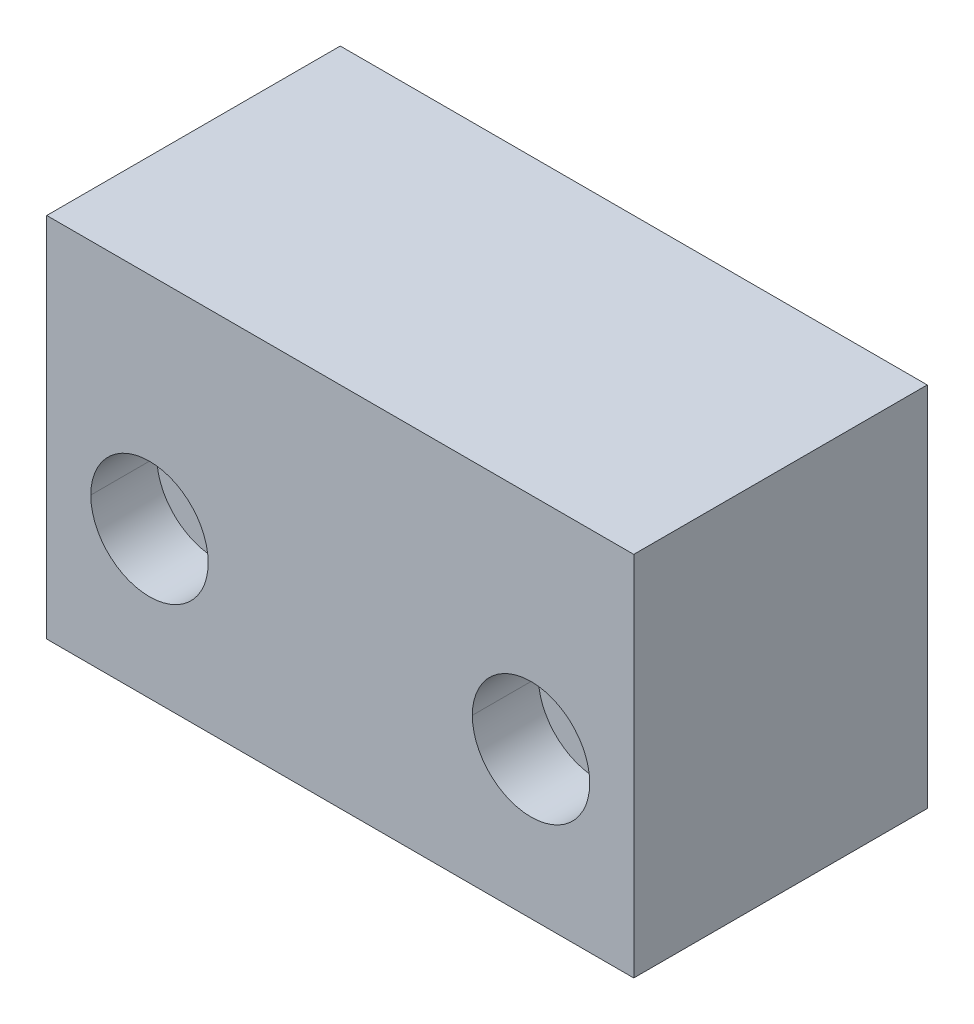
ISO-10303-21;
HEADER;
FILE_DESCRIPTION(('STEP AP214'),'2;1');
FILE_NAME('part.step','',(''),(''),'','','');
FILE_SCHEMA(('AUTOMOTIVE_DESIGN { 1 0 10303 214 1 1 1 1 }'));
ENDSEC;
DATA;
#1=APPLICATION_CONTEXT('core data for automotive mechanical design processes');
#2=APPLICATION_PROTOCOL_DEFINITION('international standard','automotive_design',2000,#1);
#3=PRODUCT_CONTEXT('',#1,'mechanical');
#4=PRODUCT('Part','Part','',(#3));
#5=PRODUCT_RELATED_PRODUCT_CATEGORY('part','',(#4));
#6=PRODUCT_DEFINITION_FORMATION('','',#4);
#7=PRODUCT_DEFINITION_CONTEXT('part definition',#1,'design');
#8=PRODUCT_DEFINITION('design','',#6,#7);
#9=PRODUCT_DEFINITION_SHAPE('','',#8);
#10=(LENGTH_UNIT() NAMED_UNIT(*) SI_UNIT(.MILLI.,.METRE.));
#11=(NAMED_UNIT(*) PLANE_ANGLE_UNIT() SI_UNIT($,.RADIAN.));
#12=(NAMED_UNIT(*) SI_UNIT($,.STERADIAN.) SOLID_ANGLE_UNIT());
#13=UNCERTAINTY_MEASURE_WITH_UNIT(LENGTH_MEASURE(1.E-05),#10,'distance_accuracy_value','');
#14=(GEOMETRIC_REPRESENTATION_CONTEXT(3) GLOBAL_UNCERTAINTY_ASSIGNED_CONTEXT((#13)) GLOBAL_UNIT_ASSIGNED_CONTEXT((#10,
#11,#12)) REPRESENTATION_CONTEXT('',''));
#15=CARTESIAN_POINT('',(0.,0.,0.));
#16=DIRECTION('',(0.,0.,1.));
#17=DIRECTION('',(1.,0.,0.));
#18=AXIS2_PLACEMENT_3D('',#15,#16,#17);
#19=CARTESIAN_POINT('',(0.,25.,20.));
#20=DIRECTION('',(1.,0.,0.));
#21=DIRECTION('',(0.,0.,-1.));
#22=AXIS2_PLACEMENT_3D('',#19,#20,#21);
#23=PLANE('',#22);
#24=DIRECTION('',(0.,-1.,0.));
#25=VECTOR('',#24,1.);
#26=CARTESIAN_POINT('',(0.,25.,0.));
#27=LINE('',#26,#25);
#28=CARTESIAN_POINT('',(0.,25.,0.));
#29=VERTEX_POINT('',#28);
#30=CARTESIAN_POINT('',(0.,0.,0.));
#31=VERTEX_POINT('',#30);
#32=EDGE_CURVE('E11',#29,#31,#27,.T.);
#33=ORIENTED_EDGE('',*,*,#32,.T.);
#34=DIRECTION('',(0.,0.,-1.));
#35=VECTOR('',#34,1.);
#36=CARTESIAN_POINT('',(0.,0.,20.));
#37=LINE('',#36,#35);
#38=CARTESIAN_POINT('',(0.,0.,20.));
#39=VERTEX_POINT('',#38);
#40=EDGE_CURVE('E25',#39,#31,#37,.T.);
#41=ORIENTED_EDGE('',*,*,#40,.F.);
#42=DIRECTION('',(0.,-1.,0.));
#43=VECTOR('',#42,1.);
#44=CARTESIAN_POINT('',(0.,25.,20.));
#45=LINE('',#44,#43);
#46=CARTESIAN_POINT('',(0.,25.,20.));
#47=VERTEX_POINT('',#46);
#48=EDGE_CURVE('E265',#47,#39,#45,.T.);
#49=ORIENTED_EDGE('',*,*,#48,.F.);
#50=DIRECTION('',(0.,0.,-1.));
#51=VECTOR('',#50,1.);
#52=CARTESIAN_POINT('',(0.,25.,20.));
#53=LINE('',#52,#51);
#54=EDGE_CURVE('E261',#47,#29,#53,.T.);
#55=ORIENTED_EDGE('',*,*,#54,.T.);
#56=EDGE_LOOP('',(#33,#41,#49,#55));
#57=FACE_BOUND('',#56,.T.);
#58=ADVANCED_FACE('F17',(#57),#23,.F.);
#59=CARTESIAN_POINT('',(40.,25.,20.));
#60=DIRECTION('',(0.,-1.,0.));
#61=DIRECTION('',(0.,0.,-1.));
#62=AXIS2_PLACEMENT_3D('',#59,#60,#61);
#63=PLANE('',#62);
#64=DIRECTION('',(-1.,0.,0.));
#65=VECTOR('',#64,1.);
#66=CARTESIAN_POINT('',(40.,25.,0.));
#67=LINE('',#66,#65);
#68=CARTESIAN_POINT('',(40.,25.,0.));
#69=VERTEX_POINT('',#68);
#70=EDGE_CURVE('E256',#69,#29,#67,.T.);
#71=ORIENTED_EDGE('',*,*,#70,.T.);
#72=ORIENTED_EDGE('',*,*,#54,.F.);
#73=DIRECTION('',(-1.,0.,0.));
#74=VECTOR('',#73,1.);
#75=CARTESIAN_POINT('',(40.,25.,20.));
#76=LINE('',#75,#74);
#77=CARTESIAN_POINT('',(40.,25.,20.));
#78=VERTEX_POINT('',#77);
#79=EDGE_CURVE('E251',#78,#47,#76,.T.);
#80=ORIENTED_EDGE('',*,*,#79,.F.);
#81=DIRECTION('',(0.,0.,-1.));
#82=VECTOR('',#81,1.);
#83=CARTESIAN_POINT('',(40.,25.,20.));
#84=LINE('',#83,#82);
#85=EDGE_CURVE('E247',#78,#69,#84,.T.);
#86=ORIENTED_EDGE('',*,*,#85,.T.);
#87=EDGE_LOOP('',(#71,#72,#80,#86));
#88=FACE_BOUND('',#87,.T.);
#89=ADVANCED_FACE('F283',(#88),#63,.F.);
#90=CARTESIAN_POINT('',(40.,0.,20.));
#91=DIRECTION('',(-1.,0.,0.));
#92=DIRECTION('',(0.,0.,1.));
#93=AXIS2_PLACEMENT_3D('',#90,#91,#92);
#94=PLANE('',#93);
#95=DIRECTION('',(0.,1.,0.));
#96=VECTOR('',#95,1.);
#97=CARTESIAN_POINT('',(40.,0.,0.));
#98=LINE('',#97,#96);
#99=CARTESIAN_POINT('',(40.,0.,0.));
#100=VERTEX_POINT('',#99);
#101=EDGE_CURVE('E242',#100,#69,#98,.T.);
#102=ORIENTED_EDGE('',*,*,#101,.T.);
#103=ORIENTED_EDGE('',*,*,#85,.F.);
#104=DIRECTION('',(0.,1.,0.));
#105=VECTOR('',#104,1.);
#106=CARTESIAN_POINT('',(40.,0.,20.));
#107=LINE('',#106,#105);
#108=CARTESIAN_POINT('',(40.,0.,20.));
#109=VERTEX_POINT('',#108);
#110=EDGE_CURVE('E237',#109,#78,#107,.T.);
#111=ORIENTED_EDGE('',*,*,#110,.F.);
#112=DIRECTION('',(0.,0.,-1.));
#113=VECTOR('',#112,1.);
#114=CARTESIAN_POINT('',(40.,0.,20.));
#115=LINE('',#114,#113);
#116=EDGE_CURVE('E233',#109,#100,#115,.T.);
#117=ORIENTED_EDGE('',*,*,#116,.T.);
#118=EDGE_LOOP('',(#102,#103,#111,#117));
#119=FACE_BOUND('',#118,.T.);
#120=ADVANCED_FACE('F288',(#119),#94,.F.);
#121=CARTESIAN_POINT('',(0.,0.,20.));
#122=DIRECTION('',(0.,1.,0.));
#123=DIRECTION('',(0.,0.,1.));
#124=AXIS2_PLACEMENT_3D('',#121,#122,#123);
#125=PLANE('',#124);
#126=DIRECTION('',(1.,0.,0.));
#127=VECTOR('',#126,1.);
#128=CARTESIAN_POINT('',(0.,0.,0.));
#129=LINE('',#128,#127);
#130=EDGE_CURVE('E228',#31,#100,#129,.T.);
#131=ORIENTED_EDGE('',*,*,#130,.T.);
#132=ORIENTED_EDGE('',*,*,#116,.F.);
#133=DIRECTION('',(1.,0.,0.));
#134=VECTOR('',#133,1.);
#135=CARTESIAN_POINT('',(0.,0.,20.));
#136=LINE('',#135,#134);
#137=EDGE_CURVE('E223',#39,#109,#136,.T.);
#138=ORIENTED_EDGE('',*,*,#137,.F.);
#139=ORIENTED_EDGE('',*,*,#40,.T.);
#140=EDGE_LOOP('',(#131,#132,#138,#139));
#141=FACE_BOUND('',#140,.T.);
#142=ADVANCED_FACE('F275',(#141),#125,.F.);
#143=CARTESIAN_POINT('',(0.,0.,20.));
#144=DIRECTION('',(0.,0.,1.));
#145=DIRECTION('',(1.,0.,0.));
#146=AXIS2_PLACEMENT_3D('',#143,#144,#145);
#147=PLANE('',#146);
#148=CARTESIAN_POINT('',(33.,10.,20.));
#149=DIRECTION('',(0.,0.,1.));
#150=DIRECTION('',(1.,0.,0.));
#151=AXIS2_PLACEMENT_3D('',#148,#149,#150);
#152=CIRCLE('',#151,4.);
#153=CARTESIAN_POINT('',(29.,10.,20.));
#154=VERTEX_POINT('',#153);
#155=CARTESIAN_POINT('',(37.,10.,20.));
#156=VERTEX_POINT('',#155);
#157=EDGE_CURVE('E121',#154,#156,#152,.T.);
#158=ORIENTED_EDGE('',*,*,#157,.F.);
#159=CARTESIAN_POINT('',(33.,10.,20.));
#160=DIRECTION('',(0.,0.,1.));
#161=DIRECTION('',(1.,0.,0.));
#162=AXIS2_PLACEMENT_3D('',#159,#160,#161);
#163=CIRCLE('',#162,4.);
#164=EDGE_CURVE('E216',#156,#154,#163,.T.);
#165=ORIENTED_EDGE('',*,*,#164,.F.);
#166=EDGE_LOOP('',(#158,#165));
#167=FACE_BOUND('',#166,.T.);
#168=CARTESIAN_POINT('',(7.,10.,20.));
#169=DIRECTION('',(0.,0.,1.));
#170=DIRECTION('',(1.,0.,0.));
#171=AXIS2_PLACEMENT_3D('',#168,#169,#170);
#172=CIRCLE('',#171,4.);
#173=CARTESIAN_POINT('',(3.,10.,20.));
#174=VERTEX_POINT('',#173);
#175=CARTESIAN_POINT('',(11.,10.,20.));
#176=VERTEX_POINT('',#175);
#177=EDGE_CURVE('E211',#174,#176,#172,.T.);
#178=ORIENTED_EDGE('',*,*,#177,.F.);
#179=CARTESIAN_POINT('',(7.,10.,20.));
#180=DIRECTION('',(0.,0.,1.));
#181=DIRECTION('',(1.,0.,0.));
#182=AXIS2_PLACEMENT_3D('',#179,#180,#181);
#183=CIRCLE('',#182,4.);
#184=EDGE_CURVE('E206',#176,#174,#183,.T.);
#185=ORIENTED_EDGE('',*,*,#184,.F.);
#186=EDGE_LOOP('',(#178,#185));
#187=FACE_BOUND('',#186,.T.);
#188=ORIENTED_EDGE('',*,*,#48,.T.);
#189=ORIENTED_EDGE('',*,*,#137,.T.);
#190=ORIENTED_EDGE('',*,*,#110,.T.);
#191=ORIENTED_EDGE('',*,*,#79,.T.);
#192=EDGE_LOOP('',(#188,#189,#190,#191));
#193=FACE_BOUND('',#192,.T.);
#194=ADVANCED_FACE('F279',(#167,#187,#193),#147,.T.);
#195=CARTESIAN_POINT('',(7.,10.,20.));
#196=DIRECTION('',(0.,0.,1.));
#197=DIRECTION('',(0.,-1.,0.));
#198=AXIS2_PLACEMENT_3D('',#195,#196,#197);
#199=CYLINDRICAL_SURFACE('',#198,4.);
#200=DIRECTION('',(0.,0.,1.));
#201=VECTOR('',#200,1.);
#202=CARTESIAN_POINT('',(3.,10.,15.5));
#203=LINE('',#202,#201);
#204=CARTESIAN_POINT('',(3.,10.,15.5));
#205=VERTEX_POINT('',#204);
#206=EDGE_CURVE('E201',#205,#174,#203,.T.);
#207=ORIENTED_EDGE('',*,*,#206,.F.);
#208=CARTESIAN_POINT('',(7.,10.,15.5));
#209=DIRECTION('',(0.,0.,1.));
#210=DIRECTION('',(1.,0.,0.));
#211=AXIS2_PLACEMENT_3D('',#208,#209,#210);
#212=CIRCLE('',#211,4.);
#213=CARTESIAN_POINT('',(11.,10.,15.5));
#214=VERTEX_POINT('',#213);
#215=EDGE_CURVE('E196',#214,#205,#212,.T.);
#216=ORIENTED_EDGE('',*,*,#215,.F.);
#217=DIRECTION('',(0.,0.,1.));
#218=VECTOR('',#217,1.);
#219=CARTESIAN_POINT('',(11.,10.,15.5));
#220=LINE('',#219,#218);
#221=EDGE_CURVE('E191',#214,#176,#220,.T.);
#222=ORIENTED_EDGE('',*,*,#221,.T.);
#223=ORIENTED_EDGE('',*,*,#184,.T.);
#224=EDGE_LOOP('',(#207,#216,#222,#223));
#225=FACE_BOUND('',#224,.T.);
#226=ADVANCED_FACE('F331',(#225),#199,.F.);
#227=CARTESIAN_POINT('',(7.,10.,20.));
#228=DIRECTION('',(0.,0.,1.));
#229=DIRECTION('',(0.,1.,0.));
#230=AXIS2_PLACEMENT_3D('',#227,#228,#229);
#231=CYLINDRICAL_SURFACE('',#230,4.);
#232=ORIENTED_EDGE('',*,*,#206,.T.);
#233=ORIENTED_EDGE('',*,*,#177,.T.);
#234=ORIENTED_EDGE('',*,*,#221,.F.);
#235=CARTESIAN_POINT('',(7.,10.,15.5));
#236=DIRECTION('',(0.,0.,1.));
#237=DIRECTION('',(1.,0.,0.));
#238=AXIS2_PLACEMENT_3D('',#235,#236,#237);
#239=CIRCLE('',#238,4.);
#240=EDGE_CURVE('E186',#205,#214,#239,.T.);
#241=ORIENTED_EDGE('',*,*,#240,.F.);
#242=EDGE_LOOP('',(#232,#233,#234,#241));
#243=FACE_BOUND('',#242,.T.);
#244=ADVANCED_FACE('F342',(#243),#231,.F.);
#245=CARTESIAN_POINT('',(9.25,10.,15.5));
#246=DIRECTION('',(0.,0.,1.));
#247=DIRECTION('',(1.,0.,0.));
#248=AXIS2_PLACEMENT_3D('',#245,#246,#247);
#249=PLANE('',#248);
#250=ORIENTED_EDGE('',*,*,#215,.T.);
#251=ORIENTED_EDGE('',*,*,#240,.T.);
#252=EDGE_LOOP('',(#250,#251));
#253=FACE_BOUND('',#252,.T.);
#254=CARTESIAN_POINT('',(7.,10.,15.5));
#255=DIRECTION('',(0.,0.,1.));
#256=DIRECTION('',(1.,0.,0.));
#257=AXIS2_PLACEMENT_3D('',#254,#255,#256);
#258=CIRCLE('',#257,2.25);
#259=CARTESIAN_POINT('',(4.75,10.,15.5));
#260=VERTEX_POINT('',#259);
#261=CARTESIAN_POINT('',(9.25,10.,15.5));
#262=VERTEX_POINT('',#261);
#263=EDGE_CURVE('E181',#260,#262,#258,.T.);
#264=ORIENTED_EDGE('',*,*,#263,.F.);
#265=CARTESIAN_POINT('',(7.,10.,15.5));
#266=DIRECTION('',(0.,0.,1.));
#267=DIRECTION('',(1.,0.,0.));
#268=AXIS2_PLACEMENT_3D('',#265,#266,#267);
#269=CIRCLE('',#268,2.25);
#270=EDGE_CURVE('E176',#262,#260,#269,.T.);
#271=ORIENTED_EDGE('',*,*,#270,.F.);
#272=EDGE_LOOP('',(#264,#271));
#273=FACE_BOUND('',#272,.T.);
#274=ADVANCED_FACE('F353',(#253,#273),#249,.T.);
#275=CARTESIAN_POINT('',(7.,10.,20.));
#276=DIRECTION('',(0.,0.,1.));
#277=DIRECTION('',(0.,-1.,0.));
#278=AXIS2_PLACEMENT_3D('',#275,#276,#277);
#279=CYLINDRICAL_SURFACE('',#278,2.25);
#280=DIRECTION('',(0.,0.,1.));
#281=VECTOR('',#280,1.);
#282=CARTESIAN_POINT('',(4.75,10.,0.));
#283=LINE('',#282,#281);
#284=CARTESIAN_POINT('',(4.75,10.,0.));
#285=VERTEX_POINT('',#284);
#286=EDGE_CURVE('E171',#285,#260,#283,.T.);
#287=ORIENTED_EDGE('',*,*,#286,.F.);
#288=CARTESIAN_POINT('',(7.,10.,0.));
#289=DIRECTION('',(0.,0.,1.));
#290=DIRECTION('',(1.,0.,0.));
#291=AXIS2_PLACEMENT_3D('',#288,#289,#290);
#292=CIRCLE('',#291,2.25);
#293=CARTESIAN_POINT('',(9.25,10.,0.));
#294=VERTEX_POINT('',#293);
#295=EDGE_CURVE('E166',#294,#285,#292,.T.);
#296=ORIENTED_EDGE('',*,*,#295,.F.);
#297=DIRECTION('',(0.,0.,1.));
#298=VECTOR('',#297,1.);
#299=CARTESIAN_POINT('',(9.25,10.,0.));
#300=LINE('',#299,#298);
#301=EDGE_CURVE('E161',#294,#262,#300,.T.);
#302=ORIENTED_EDGE('',*,*,#301,.T.);
#303=ORIENTED_EDGE('',*,*,#270,.T.);
#304=EDGE_LOOP('',(#287,#296,#302,#303));
#305=FACE_BOUND('',#304,.T.);
#306=ADVANCED_FACE('F364',(#305),#279,.F.);
#307=CARTESIAN_POINT('',(7.,10.,20.));
#308=DIRECTION('',(0.,0.,1.));
#309=DIRECTION('',(0.,1.,0.));
#310=AXIS2_PLACEMENT_3D('',#307,#308,#309);
#311=CYLINDRICAL_SURFACE('',#310,2.25);
#312=ORIENTED_EDGE('',*,*,#286,.T.);
#313=ORIENTED_EDGE('',*,*,#263,.T.);
#314=ORIENTED_EDGE('',*,*,#301,.F.);
#315=CARTESIAN_POINT('',(7.,10.,0.));
#316=DIRECTION('',(0.,0.,1.));
#317=DIRECTION('',(1.,0.,0.));
#318=AXIS2_PLACEMENT_3D('',#315,#316,#317);
#319=CIRCLE('',#318,2.25);
#320=EDGE_CURVE('E156',#285,#294,#319,.T.);
#321=ORIENTED_EDGE('',*,*,#320,.F.);
#322=EDGE_LOOP('',(#312,#313,#314,#321));
#323=FACE_BOUND('',#322,.T.);
#324=ADVANCED_FACE('F375',(#323),#311,.F.);
#325=CARTESIAN_POINT('',(0.,0.,0.));
#326=DIRECTION('',(0.,0.,1.));
#327=DIRECTION('',(1.,0.,0.));
#328=AXIS2_PLACEMENT_3D('',#325,#326,#327);
#329=PLANE('',#328);
#330=CARTESIAN_POINT('',(33.,10.,0.));
#331=DIRECTION('',(0.,0.,1.));
#332=DIRECTION('',(1.,0.,0.));
#333=AXIS2_PLACEMENT_3D('',#330,#331,#332);
#334=CIRCLE('',#333,2.25);
#335=CARTESIAN_POINT('',(35.25,10.,0.));
#336=VERTEX_POINT('',#335);
#337=CARTESIAN_POINT('',(30.75,10.,0.));
#338=VERTEX_POINT('',#337);
#339=EDGE_CURVE('E152',#336,#338,#334,.T.);
#340=ORIENTED_EDGE('',*,*,#339,.T.);
#341=CARTESIAN_POINT('',(33.,10.,0.));
#342=DIRECTION('',(0.,0.,1.));
#343=DIRECTION('',(1.,0.,0.));
#344=AXIS2_PLACEMENT_3D('',#341,#342,#343);
#345=CIRCLE('',#344,2.25);
#346=EDGE_CURVE('E148',#338,#336,#345,.T.);
#347=ORIENTED_EDGE('',*,*,#346,.T.);
#348=EDGE_LOOP('',(#340,#347));
#349=FACE_BOUND('',#348,.T.);
#350=ORIENTED_EDGE('',*,*,#295,.T.);
#351=ORIENTED_EDGE('',*,*,#320,.T.);
#352=EDGE_LOOP('',(#350,#351));
#353=FACE_BOUND('',#352,.T.);
#354=ORIENTED_EDGE('',*,*,#32,.F.);
#355=ORIENTED_EDGE('',*,*,#70,.F.);
#356=ORIENTED_EDGE('',*,*,#101,.F.);
#357=ORIENTED_EDGE('',*,*,#130,.F.);
#358=EDGE_LOOP('',(#354,#355,#356,#357));
#359=FACE_BOUND('',#358,.T.);
#360=ADVANCED_FACE('F286',(#349,#353,#359),#329,.F.);
#361=CARTESIAN_POINT('',(33.,10.,20.));
#362=DIRECTION('',(0.,0.,1.));
#363=DIRECTION('',(0.,1.,0.));
#364=AXIS2_PLACEMENT_3D('',#361,#362,#363);
#365=CYLINDRICAL_SURFACE('',#364,2.25);
#366=DIRECTION('',(0.,0.,1.));
#367=VECTOR('',#366,1.);
#368=CARTESIAN_POINT('',(30.75,10.,0.));
#369=LINE('',#368,#367);
#370=CARTESIAN_POINT('',(30.75,10.,15.5));
#371=VERTEX_POINT('',#370);
#372=EDGE_CURVE('E144',#338,#371,#369,.T.);
#373=ORIENTED_EDGE('',*,*,#372,.T.);
#374=CARTESIAN_POINT('',(33.,10.,15.5));
#375=DIRECTION('',(0.,0.,1.));
#376=DIRECTION('',(1.,0.,0.));
#377=AXIS2_PLACEMENT_3D('',#374,#375,#376);
#378=CIRCLE('',#377,2.25);
#379=CARTESIAN_POINT('',(35.25,10.,15.5));
#380=VERTEX_POINT('',#379);
#381=EDGE_CURVE('E140',#371,#380,#378,.T.);
#382=ORIENTED_EDGE('',*,*,#381,.T.);
#383=DIRECTION('',(0.,0.,1.));
#384=VECTOR('',#383,1.);
#385=CARTESIAN_POINT('',(35.25,10.,0.));
#386=LINE('',#385,#384);
#387=EDGE_CURVE('E135',#336,#380,#386,.T.);
#388=ORIENTED_EDGE('',*,*,#387,.F.);
#389=ORIENTED_EDGE('',*,*,#346,.F.);
#390=EDGE_LOOP('',(#373,#382,#388,#389));
#391=FACE_BOUND('',#390,.T.);
#392=ADVANCED_FACE('F396',(#391),#365,.F.);
#393=CARTESIAN_POINT('',(33.,10.,20.));
#394=DIRECTION('',(0.,0.,1.));
#395=DIRECTION('',(0.,-1.,0.));
#396=AXIS2_PLACEMENT_3D('',#393,#394,#395);
#397=CYLINDRICAL_SURFACE('',#396,2.25);
#398=ORIENTED_EDGE('',*,*,#372,.F.);
#399=ORIENTED_EDGE('',*,*,#339,.F.);
#400=ORIENTED_EDGE('',*,*,#387,.T.);
#401=CARTESIAN_POINT('',(33.,10.,15.5));
#402=DIRECTION('',(0.,0.,1.));
#403=DIRECTION('',(1.,0.,0.));
#404=AXIS2_PLACEMENT_3D('',#401,#402,#403);
#405=CIRCLE('',#404,2.25);
#406=EDGE_CURVE('E118',#380,#371,#405,.T.);
#407=ORIENTED_EDGE('',*,*,#406,.T.);
#408=EDGE_LOOP('',(#398,#399,#400,#407));
#409=FACE_BOUND('',#408,.T.);
#410=ADVANCED_FACE('F407',(#409),#397,.F.);
#411=CARTESIAN_POINT('',(35.25,10.,15.5));
#412=DIRECTION('',(0.,0.,1.));
#413=DIRECTION('',(1.,0.,0.));
#414=AXIS2_PLACEMENT_3D('',#411,#412,#413);
#415=PLANE('',#414);
#416=CARTESIAN_POINT('',(33.,10.,15.5));
#417=DIRECTION('',(0.,0.,1.));
#418=DIRECTION('',(1.,0.,0.));
#419=AXIS2_PLACEMENT_3D('',#416,#417,#418);
#420=CIRCLE('',#419,4.);
#421=CARTESIAN_POINT('',(37.,10.,15.5));
#422=VERTEX_POINT('',#421);
#423=CARTESIAN_POINT('',(29.,10.,15.5));
#424=VERTEX_POINT('',#423);
#425=EDGE_CURVE('E105',#422,#424,#420,.T.);
#426=ORIENTED_EDGE('',*,*,#425,.T.);
#427=CARTESIAN_POINT('',(33.,10.,15.5));
#428=DIRECTION('',(0.,0.,1.));
#429=DIRECTION('',(1.,0.,0.));
#430=AXIS2_PLACEMENT_3D('',#427,#428,#429);
#431=CIRCLE('',#430,4.);
#432=EDGE_CURVE('E101',#424,#422,#431,.T.);
#433=ORIENTED_EDGE('',*,*,#432,.T.);
#434=EDGE_LOOP('',(#426,#433));
#435=FACE_BOUND('',#434,.T.);
#436=ORIENTED_EDGE('',*,*,#381,.F.);
#437=ORIENTED_EDGE('',*,*,#406,.F.);
#438=EDGE_LOOP('',(#436,#437));
#439=FACE_BOUND('',#438,.T.);
#440=ADVANCED_FACE('F103',(#435,#439),#415,.T.);
#441=CARTESIAN_POINT('',(33.,10.,20.));
#442=DIRECTION('',(0.,0.,1.));
#443=DIRECTION('',(0.,1.,0.));
#444=AXIS2_PLACEMENT_3D('',#441,#442,#443);
#445=CYLINDRICAL_SURFACE('',#444,4.);
#446=DIRECTION('',(0.,0.,1.));
#447=VECTOR('',#446,1.);
#448=CARTESIAN_POINT('',(29.,10.,15.5));
#449=LINE('',#448,#447);
#450=EDGE_CURVE('E110',#424,#154,#449,.T.);
#451=ORIENTED_EDGE('',*,*,#450,.T.);
#452=ORIENTED_EDGE('',*,*,#157,.T.);
#453=DIRECTION('',(0.,0.,1.));
#454=VECTOR('',#453,1.);
#455=CARTESIAN_POINT('',(37.,10.,15.5));
#456=LINE('',#455,#454);
#457=EDGE_CURVE('E116',#422,#156,#456,.T.);
#458=ORIENTED_EDGE('',*,*,#457,.F.);
#459=ORIENTED_EDGE('',*,*,#432,.F.);
#460=EDGE_LOOP('',(#451,#452,#458,#459));
#461=FACE_BOUND('',#460,.T.);
#462=ADVANCED_FACE('F120',(#461),#445,.F.);
#463=CARTESIAN_POINT('',(33.,10.,20.));
#464=DIRECTION('',(0.,0.,1.));
#465=DIRECTION('',(0.,-1.,0.));
#466=AXIS2_PLACEMENT_3D('',#463,#464,#465);
#467=CYLINDRICAL_SURFACE('',#466,4.);
#468=ORIENTED_EDGE('',*,*,#450,.F.);
#469=ORIENTED_EDGE('',*,*,#425,.F.);
#470=ORIENTED_EDGE('',*,*,#457,.T.);
#471=ORIENTED_EDGE('',*,*,#164,.T.);
#472=EDGE_LOOP('',(#468,#469,#470,#471));
#473=FACE_BOUND('',#472,.T.);
#474=ADVANCED_FACE('F114',(#473),#467,.F.);
#475=CLOSED_SHELL('',(#58,#89,#120,#142,#194,#226,#244,#274,#306,#324,#360,#392,#410,#440,#462,#474));
#476=MANIFOLD_SOLID_BREP('B1',#475);
#477=ADVANCED_BREP_SHAPE_REPRESENTATION('',(#18,#476),#14);
#478=SHAPE_DEFINITION_REPRESENTATION(#9,#477);
ENDSEC;
END-ISO-10303-21;
